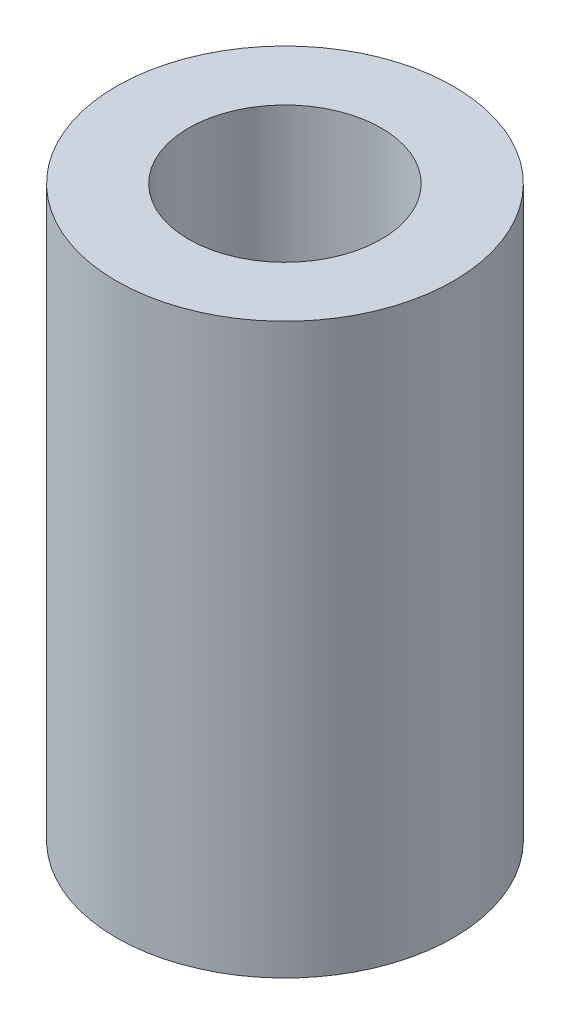
ISO-10303-21;
HEADER;
FILE_DESCRIPTION(('STEP AP214'),'2;1');
FILE_NAME('part.step','',(''),(''),'','','');
FILE_SCHEMA(('AUTOMOTIVE_DESIGN { 1 0 10303 214 1 1 1 1 }'));
ENDSEC;
DATA;
#1=APPLICATION_CONTEXT('core data for automotive mechanical design processes');
#2=APPLICATION_PROTOCOL_DEFINITION('international standard','automotive_design',2000,#1);
#3=PRODUCT_CONTEXT('',#1,'mechanical');
#4=PRODUCT('Part','Part','',(#3));
#5=PRODUCT_RELATED_PRODUCT_CATEGORY('part','',(#4));
#6=PRODUCT_DEFINITION_FORMATION('','',#4);
#7=PRODUCT_DEFINITION_CONTEXT('part definition',#1,'design');
#8=PRODUCT_DEFINITION('design','',#6,#7);
#9=PRODUCT_DEFINITION_SHAPE('','',#8);
#10=(LENGTH_UNIT() NAMED_UNIT(*) SI_UNIT(.MILLI.,.METRE.));
#11=(NAMED_UNIT(*) PLANE_ANGLE_UNIT() SI_UNIT($,.RADIAN.));
#12=(NAMED_UNIT(*) SI_UNIT($,.STERADIAN.) SOLID_ANGLE_UNIT());
#13=UNCERTAINTY_MEASURE_WITH_UNIT(LENGTH_MEASURE(1.E-05),#10,'distance_accuracy_value','');
#14=(GEOMETRIC_REPRESENTATION_CONTEXT(3) GLOBAL_UNCERTAINTY_ASSIGNED_CONTEXT((#13)) GLOBAL_UNIT_ASSIGNED_CONTEXT((#10,
#11,#12)) REPRESENTATION_CONTEXT('',''));
#15=CARTESIAN_POINT('',(0.,0.,0.));
#16=DIRECTION('',(0.,0.,1.));
#17=DIRECTION('',(1.,0.,0.));
#18=AXIS2_PLACEMENT_3D('',#15,#16,#17);
#19=CARTESIAN_POINT('',(0.,18.,0.));
#20=DIRECTION('',(0.,1.,0.));
#21=DIRECTION('',(0.,0.,1.));
#22=AXIS2_PLACEMENT_3D('',#19,#20,#21);
#23=PLANE('',#22);
#24=CARTESIAN_POINT('',(0.,18.,0.));
#25=DIRECTION('',(0.,1.,0.));
#26=DIRECTION('',(0.,0.,1.));
#27=AXIS2_PLACEMENT_3D('',#24,#25,#26);
#28=CIRCLE('',#27,5.335);
#29=CARTESIAN_POINT('',(0.,18.,5.335));
#30=VERTEX_POINT('',#29);
#31=EDGE_CURVE('E10',#30,#30,#28,.T.);
#32=ORIENTED_EDGE('',*,*,#31,.T.);
#33=EDGE_LOOP('',(#32));
#34=FACE_BOUND('',#33,.T.);
#35=CARTESIAN_POINT('',(0.,18.,0.));
#36=DIRECTION('',(0.,1.,0.));
#37=DIRECTION('',(0.,0.,1.));
#38=AXIS2_PLACEMENT_3D('',#35,#36,#37);
#39=CIRCLE('',#38,3.05);
#40=CARTESIAN_POINT('',(0.,18.,3.05));
#41=VERTEX_POINT('',#40);
#42=EDGE_CURVE('E42',#41,#41,#39,.T.);
#43=ORIENTED_EDGE('',*,*,#42,.F.);
#44=EDGE_LOOP('',(#43));
#45=FACE_BOUND('',#44,.T.);
#46=ADVANCED_FACE('F31',(#34,#45),#23,.T.);
#47=CARTESIAN_POINT('',(0.,0.,0.));
#48=DIRECTION('',(0.,1.,0.));
#49=DIRECTION('',(0.,0.,1.));
#50=AXIS2_PLACEMENT_3D('',#47,#48,#49);
#51=PLANE('',#50);
#52=CARTESIAN_POINT('',(0.,0.,0.));
#53=DIRECTION('',(0.,1.,0.));
#54=DIRECTION('',(0.,0.,1.));
#55=AXIS2_PLACEMENT_3D('',#52,#53,#54);
#56=CIRCLE('',#55,5.335);
#57=CARTESIAN_POINT('',(0.,0.,5.335));
#58=VERTEX_POINT('',#57);
#59=EDGE_CURVE('E35',#58,#58,#56,.T.);
#60=ORIENTED_EDGE('',*,*,#59,.F.);
#61=EDGE_LOOP('',(#60));
#62=FACE_BOUND('',#61,.T.);
#63=CARTESIAN_POINT('',(0.,0.,0.));
#64=DIRECTION('',(0.,1.,0.));
#65=DIRECTION('',(0.,0.,1.));
#66=AXIS2_PLACEMENT_3D('',#63,#64,#65);
#67=CIRCLE('',#66,3.05);
#68=CARTESIAN_POINT('',(0.,0.,3.05));
#69=VERTEX_POINT('',#68);
#70=EDGE_CURVE('E44',#69,#69,#67,.T.);
#71=ORIENTED_EDGE('',*,*,#70,.T.);
#72=EDGE_LOOP('',(#71));
#73=FACE_BOUND('',#72,.T.);
#74=ADVANCED_FACE('F54',(#62,#73),#51,.F.);
#75=CARTESIAN_POINT('',(0.,18.,0.));
#76=DIRECTION('',(0.,-1.,0.));
#77=DIRECTION('',(0.,0.,-1.));
#78=AXIS2_PLACEMENT_3D('',#75,#76,#77);
#79=CYLINDRICAL_SURFACE('',#78,5.335);
#80=ORIENTED_EDGE('',*,*,#31,.F.);
#81=EDGE_LOOP('',(#80));
#82=FACE_BOUND('',#81,.T.);
#83=ORIENTED_EDGE('',*,*,#59,.T.);
#84=EDGE_LOOP('',(#83));
#85=FACE_BOUND('',#84,.T.);
#86=ADVANCED_FACE('F33',(#82,#85),#79,.T.);
#87=CARTESIAN_POINT('',(0.,18.,0.));
#88=DIRECTION('',(0.,-1.,0.));
#89=DIRECTION('',(0.,0.,-1.));
#90=AXIS2_PLACEMENT_3D('',#87,#88,#89);
#91=CYLINDRICAL_SURFACE('',#90,3.05);
#92=ORIENTED_EDGE('',*,*,#42,.T.);
#93=EDGE_LOOP('',(#92));
#94=FACE_BOUND('',#93,.T.);
#95=ORIENTED_EDGE('',*,*,#70,.F.);
#96=EDGE_LOOP('',(#95));
#97=FACE_BOUND('',#96,.T.);
#98=ADVANCED_FACE('F50',(#94,#97),#91,.F.);
#99=CLOSED_SHELL('',(#46,#74,#86,#98));
#100=MANIFOLD_SOLID_BREP('B2',#99);
#101=ADVANCED_BREP_SHAPE_REPRESENTATION('',(#18,#100),#14);
#102=SHAPE_DEFINITION_REPRESENTATION(#9,#101);
ENDSEC;
END-ISO-10303-21;
